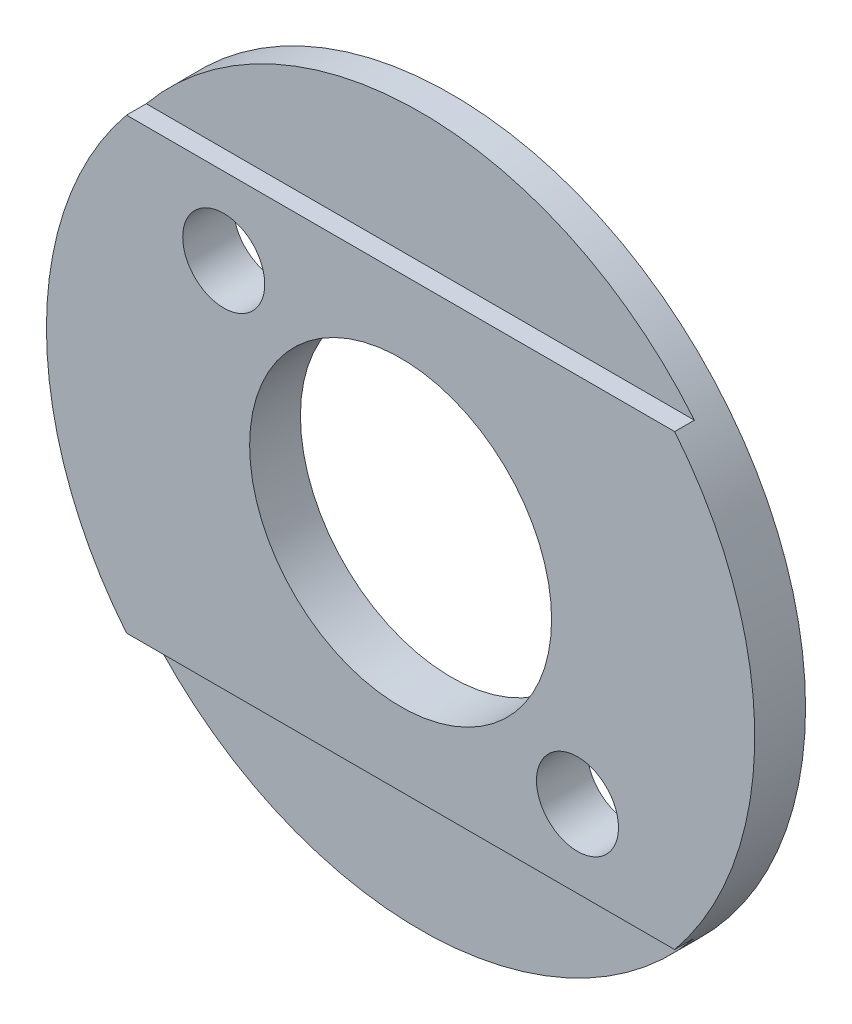
ISO-10303-21;
HEADER;
FILE_DESCRIPTION(('STEP AP214'),'2;1');
FILE_NAME('part.step','',(''),(''),'','','');
FILE_SCHEMA(('AUTOMOTIVE_DESIGN { 1 0 10303 214 1 1 1 1 }'));
ENDSEC;
DATA;
#1=APPLICATION_CONTEXT('core data for automotive mechanical design processes');
#2=APPLICATION_PROTOCOL_DEFINITION('international standard','automotive_design',2000,#1);
#3=PRODUCT_CONTEXT('',#1,'mechanical');
#4=PRODUCT('Part','Part','',(#3));
#5=PRODUCT_RELATED_PRODUCT_CATEGORY('part','',(#4));
#6=PRODUCT_DEFINITION_FORMATION('','',#4);
#7=PRODUCT_DEFINITION_CONTEXT('part definition',#1,'design');
#8=PRODUCT_DEFINITION('design','',#6,#7);
#9=PRODUCT_DEFINITION_SHAPE('','',#8);
#10=(LENGTH_UNIT() NAMED_UNIT(*) SI_UNIT(.MILLI.,.METRE.));
#11=(NAMED_UNIT(*) PLANE_ANGLE_UNIT() SI_UNIT($,.RADIAN.));
#12=(NAMED_UNIT(*) SI_UNIT($,.STERADIAN.) SOLID_ANGLE_UNIT());
#13=UNCERTAINTY_MEASURE_WITH_UNIT(LENGTH_MEASURE(1.E-05),#10,'distance_accuracy_value','');
#14=(GEOMETRIC_REPRESENTATION_CONTEXT(3) GLOBAL_UNCERTAINTY_ASSIGNED_CONTEXT((#13)) GLOBAL_UNIT_ASSIGNED_CONTEXT((#10,
#11,#12)) REPRESENTATION_CONTEXT('',''));
#15=CARTESIAN_POINT('',(0.,0.,0.));
#16=DIRECTION('',(0.,0.,1.));
#17=DIRECTION('',(1.,0.,0.));
#18=AXIS2_PLACEMENT_3D('',#15,#16,#17);
#19=CARTESIAN_POINT('',(0.,-60.0835962088021,1.5875));
#20=DIRECTION('',(0.,1.,0.));
#21=DIRECTION('',(0.,0.,1.));
#22=AXIS2_PLACEMENT_3D('',#19,#20,#21);
#23=PLANE('',#22);
#24=DIRECTION('',(1.,0.,0.));
#25=VECTOR('',#24,1.);
#26=CARTESIAN_POINT('',(0.,-60.0835962088021,0.));
#27=LINE('',#26,#25);
#28=CARTESIAN_POINT('',(-48.7637822346546,-60.0835962088021,0.));
#29=VERTEX_POINT('',#28);
#30=CARTESIAN_POINT('',(-4.65267252292782,-60.0835962088021,0.));
#31=VERTEX_POINT('',#30);
#32=EDGE_CURVE('E74',#29,#31,#27,.T.);
#33=ORIENTED_EDGE('',*,*,#32,.F.);
#34=DIRECTION('',(0.,0.,-1.));
#35=VECTOR('',#34,1.);
#36=CARTESIAN_POINT('',(-48.7637822346546,-60.0835962088021,1.5875));
#37=LINE('',#36,#35);
#38=CARTESIAN_POINT('',(-48.7637822346546,-60.0835962088021,1.5875));
#39=VERTEX_POINT('',#38);
#40=EDGE_CURVE('E11',#39,#29,#37,.T.);
#41=ORIENTED_EDGE('',*,*,#40,.F.);
#42=DIRECTION('',(1.,0.,0.));
#43=VECTOR('',#42,1.);
#44=CARTESIAN_POINT('',(0.,-60.0835962088021,1.5875));
#45=LINE('',#44,#43);
#46=CARTESIAN_POINT('',(-4.65267252292782,-60.0835962088021,1.5875));
#47=VERTEX_POINT('',#46);
#48=EDGE_CURVE('E122',#39,#47,#45,.T.);
#49=ORIENTED_EDGE('',*,*,#48,.T.);
#50=DIRECTION('',(0.,0.,-1.));
#51=VECTOR('',#50,1.);
#52=CARTESIAN_POINT('',(-4.65267252292782,-60.0835962088021,1.5875));
#53=LINE('',#52,#51);
#54=EDGE_CURVE('E89',#47,#31,#53,.T.);
#55=ORIENTED_EDGE('',*,*,#54,.T.);
#56=EDGE_LOOP('',(#33,#41,#49,#55));
#57=FACE_BOUND('',#56,.T.);
#58=ADVANCED_FACE('F35',(#57),#23,.T.);
#59=CARTESIAN_POINT('',(0.,-96.1835962088021,1.5875));
#60=DIRECTION('',(0.,1.,0.));
#61=DIRECTION('',(0.,0.,1.));
#62=AXIS2_PLACEMENT_3D('',#59,#60,#61);
#63=PLANE('',#62);
#64=DIRECTION('',(1.,0.,0.));
#65=VECTOR('',#64,1.);
#66=CARTESIAN_POINT('',(0.,-96.1835962088021,0.));
#67=LINE('',#66,#65);
#68=CARTESIAN_POINT('',(-48.7637822346546,-96.1835962088021,0.));
#69=VERTEX_POINT('',#68);
#70=CARTESIAN_POINT('',(-4.65267252292777,-96.1835962088021,0.));
#71=VERTEX_POINT('',#70);
#72=EDGE_CURVE('E90',#69,#71,#67,.T.);
#73=ORIENTED_EDGE('',*,*,#72,.T.);
#74=DIRECTION('',(0.,0.,-1.));
#75=VECTOR('',#74,1.);
#76=CARTESIAN_POINT('',(-4.65267252292777,-96.1835962088021,1.5875));
#77=LINE('',#76,#75);
#78=CARTESIAN_POINT('',(-4.65267252292777,-96.1835962088021,1.5875));
#79=VERTEX_POINT('',#78);
#80=EDGE_CURVE('E104',#79,#71,#77,.T.);
#81=ORIENTED_EDGE('',*,*,#80,.F.);
#82=DIRECTION('',(1.,0.,0.));
#83=VECTOR('',#82,1.);
#84=CARTESIAN_POINT('',(0.,-96.1835962088021,1.5875));
#85=LINE('',#84,#83);
#86=CARTESIAN_POINT('',(-48.7637822346546,-96.1835962088021,1.5875));
#87=VERTEX_POINT('',#86);
#88=EDGE_CURVE('E100',#87,#79,#85,.T.);
#89=ORIENTED_EDGE('',*,*,#88,.F.);
#90=DIRECTION('',(0.,0.,-1.));
#91=VECTOR('',#90,1.);
#92=CARTESIAN_POINT('',(-48.7637822346546,-96.1835962088021,1.5875));
#93=LINE('',#92,#91);
#94=EDGE_CURVE('E44',#87,#69,#93,.T.);
#95=ORIENTED_EDGE('',*,*,#94,.T.);
#96=EDGE_LOOP('',(#73,#81,#89,#95));
#97=FACE_BOUND('',#96,.T.);
#98=ADVANCED_FACE('F107',(#97),#63,.F.);
#99=CARTESIAN_POINT('',(-12.4743356104237,-89.9508008328408,1.5875));
#100=DIRECTION('',(0.,0.,-1.));
#101=DIRECTION('',(-1.,0.,0.));
#102=AXIS2_PLACEMENT_3D('',#99,#100,#101);
#103=CYLINDRICAL_SURFACE('',#102,3.3);
#104=CARTESIAN_POINT('',(-12.4743356104237,-89.9508008328408,1.5875));
#105=DIRECTION('',(0.,0.,1.));
#106=DIRECTION('',(1.,0.,0.));
#107=AXIS2_PLACEMENT_3D('',#104,#105,#106);
#108=CIRCLE('',#107,3.3);
#109=CARTESIAN_POINT('',(-9.1743356104237,-89.9508008328408,1.5875));
#110=VERTEX_POINT('',#109);
#111=EDGE_CURVE('E119',#110,#110,#108,.T.);
#112=ORIENTED_EDGE('',*,*,#111,.T.);
#113=EDGE_LOOP('',(#112));
#114=FACE_BOUND('',#113,.T.);
#115=CARTESIAN_POINT('',(-12.4743356104237,-89.9508008328408,-2.5));
#116=DIRECTION('',(0.,0.,-1.));
#117=DIRECTION('',(-1.,0.,0.));
#118=AXIS2_PLACEMENT_3D('',#115,#116,#117);
#119=CIRCLE('',#118,3.3);
#120=CARTESIAN_POINT('',(-15.7743356104237,-89.9508008328408,-2.5));
#121=VERTEX_POINT('',#120);
#122=EDGE_CURVE('E97',#121,#121,#119,.F.);
#123=ORIENTED_EDGE('',*,*,#122,.F.);
#124=EDGE_LOOP('',(#123));
#125=FACE_BOUND('',#124,.T.);
#126=ADVANCED_FACE('F142',(#114,#125),#103,.F.);
#127=CARTESIAN_POINT('',(-40.9421191471587,-66.3163915847635,1.5875));
#128=DIRECTION('',(0.,0.,-1.));
#129=DIRECTION('',(-1.,0.,0.));
#130=AXIS2_PLACEMENT_3D('',#127,#128,#129);
#131=CYLINDRICAL_SURFACE('',#130,3.3);
#132=CARTESIAN_POINT('',(-40.9421191471587,-66.3163915847635,1.5875));
#133=DIRECTION('',(0.,0.,1.));
#134=DIRECTION('',(1.,0.,0.));
#135=AXIS2_PLACEMENT_3D('',#132,#133,#134);
#136=CIRCLE('',#135,3.3);
#137=CARTESIAN_POINT('',(-37.6421191471587,-66.3163915847635,1.5875));
#138=VERTEX_POINT('',#137);
#139=EDGE_CURVE('E116',#138,#138,#136,.T.);
#140=ORIENTED_EDGE('',*,*,#139,.T.);
#141=EDGE_LOOP('',(#140));
#142=FACE_BOUND('',#141,.T.);
#143=CARTESIAN_POINT('',(-40.9421191471587,-66.3163915847635,-2.5));
#144=DIRECTION('',(0.,0.,-1.));
#145=DIRECTION('',(-1.,0.,0.));
#146=AXIS2_PLACEMENT_3D('',#143,#144,#145);
#147=CIRCLE('',#146,3.3);
#148=CARTESIAN_POINT('',(-44.2421191471587,-66.3163915847635,-2.5));
#149=VERTEX_POINT('',#148);
#150=EDGE_CURVE('E77',#149,#149,#147,.F.);
#151=ORIENTED_EDGE('',*,*,#150,.F.);
#152=EDGE_LOOP('',(#151));
#153=FACE_BOUND('',#152,.T.);
#154=ADVANCED_FACE('F146',(#142,#153),#131,.F.);
#155=CARTESIAN_POINT('',(-26.7082273787912,-78.1335962088021,1.5875));
#156=DIRECTION('',(0.,0.,-1.));
#157=DIRECTION('',(-1.,0.,0.));
#158=AXIS2_PLACEMENT_3D('',#155,#156,#157);
#159=CYLINDRICAL_SURFACE('',#158,12.15);
#160=CARTESIAN_POINT('',(-26.7082273787912,-78.1335962088021,1.5875));
#161=DIRECTION('',(0.,0.,1.));
#162=DIRECTION('',(1.,0.,0.));
#163=AXIS2_PLACEMENT_3D('',#160,#161,#162);
#164=CIRCLE('',#163,12.15);
#165=CARTESIAN_POINT('',(-14.5582273787912,-78.1335962088021,1.5875));
#166=VERTEX_POINT('',#165);
#167=EDGE_CURVE('E94',#166,#166,#164,.T.);
#168=ORIENTED_EDGE('',*,*,#167,.T.);
#169=EDGE_LOOP('',(#168));
#170=FACE_BOUND('',#169,.T.);
#171=CARTESIAN_POINT('',(-26.7082273787912,-78.1335962088021,-2.5));
#172=DIRECTION('',(0.,0.,-1.));
#173=DIRECTION('',(-1.,0.,0.));
#174=AXIS2_PLACEMENT_3D('',#171,#172,#173);
#175=CIRCLE('',#174,12.15);
#176=CARTESIAN_POINT('',(-38.8582273787912,-78.1335962088021,-2.5));
#177=VERTEX_POINT('',#176);
#178=EDGE_CURVE('E91',#177,#177,#175,.F.);
#179=ORIENTED_EDGE('',*,*,#178,.F.);
#180=EDGE_LOOP('',(#179));
#181=FACE_BOUND('',#180,.T.);
#182=ADVANCED_FACE('F37',(#170,#181),#159,.F.);
#183=CARTESIAN_POINT('',(-26.7082273787912,-78.1335962088021,1.5875));
#184=DIRECTION('',(0.,0.,-1.));
#185=DIRECTION('',(-1.,0.,0.));
#186=AXIS2_PLACEMENT_3D('',#183,#184,#185);
#187=CYLINDRICAL_SURFACE('',#186,28.5);
#188=ORIENTED_EDGE('',*,*,#80,.T.);
#189=CARTESIAN_POINT('',(-26.7082273787912,-78.1335962088021,0.));
#190=DIRECTION('',(0.,0.,-1.));
#191=DIRECTION('',(-1.,0.,0.));
#192=AXIS2_PLACEMENT_3D('',#189,#190,#191);
#193=CIRCLE('',#192,28.5);
#194=EDGE_CURVE('E78',#71,#69,#193,.T.);
#195=ORIENTED_EDGE('',*,*,#194,.T.);
#196=ORIENTED_EDGE('',*,*,#94,.F.);
#197=CARTESIAN_POINT('',(-26.7082273787912,-78.1335962088021,1.5875));
#198=DIRECTION('',(0.,0.,1.));
#199=DIRECTION('',(1.,0.,0.));
#200=AXIS2_PLACEMENT_3D('',#197,#198,#199);
#201=CIRCLE('',#200,28.5);
#202=EDGE_CURVE('E86',#39,#87,#201,.T.);
#203=ORIENTED_EDGE('',*,*,#202,.F.);
#204=ORIENTED_EDGE('',*,*,#40,.T.);
#205=EDGE_CURVE('E71',#29,#31,#193,.T.);
#206=ORIENTED_EDGE('',*,*,#205,.T.);
#207=ORIENTED_EDGE('',*,*,#54,.F.);
#208=EDGE_CURVE('E51',#79,#47,#201,.T.);
#209=ORIENTED_EDGE('',*,*,#208,.F.);
#210=EDGE_LOOP('',(#188,#195,#196,#203,#204,#206,#207,#209));
#211=FACE_BOUND('',#210,.T.);
#212=CARTESIAN_POINT('',(-26.7082273787912,-78.1335962088021,-2.5));
#213=DIRECTION('',(0.,0.,-1.));
#214=DIRECTION('',(-1.,0.,0.));
#215=AXIS2_PLACEMENT_3D('',#212,#213,#214);
#216=CIRCLE('',#215,28.5);
#217=CARTESIAN_POINT('',(-55.2082273787912,-78.1335962088021,-2.5));
#218=VERTEX_POINT('',#217);
#219=EDGE_CURVE('E159',#218,#218,#216,.T.);
#220=ORIENTED_EDGE('',*,*,#219,.F.);
#221=EDGE_LOOP('',(#220));
#222=FACE_BOUND('',#221,.T.);
#223=ADVANCED_FACE('F82',(#211,#222),#187,.T.);
#224=CARTESIAN_POINT('',(0.,0.,1.5875));
#225=DIRECTION('',(0.,0.,1.));
#226=DIRECTION('',(1.,0.,0.));
#227=AXIS2_PLACEMENT_3D('',#224,#225,#226);
#228=PLANE('',#227);
#229=ORIENTED_EDGE('',*,*,#167,.F.);
#230=EDGE_LOOP('',(#229));
#231=FACE_BOUND('',#230,.T.);
#232=ORIENTED_EDGE('',*,*,#139,.F.);
#233=EDGE_LOOP('',(#232));
#234=FACE_BOUND('',#233,.T.);
#235=ORIENTED_EDGE('',*,*,#111,.F.);
#236=EDGE_LOOP('',(#235));
#237=FACE_BOUND('',#236,.T.);
#238=ORIENTED_EDGE('',*,*,#48,.F.);
#239=ORIENTED_EDGE('',*,*,#202,.T.);
#240=ORIENTED_EDGE('',*,*,#88,.T.);
#241=ORIENTED_EDGE('',*,*,#208,.T.);
#242=EDGE_LOOP('',(#238,#239,#240,#241));
#243=FACE_BOUND('',#242,.T.);
#244=ADVANCED_FACE('F123',(#231,#234,#237,#243),#228,.T.);
#245=CARTESIAN_POINT('',(0.,0.,0.));
#246=DIRECTION('',(0.,0.,-1.));
#247=DIRECTION('',(-1.,0.,0.));
#248=AXIS2_PLACEMENT_3D('',#245,#246,#247);
#249=PLANE('',#248);
#250=ORIENTED_EDGE('',*,*,#205,.F.);
#251=ORIENTED_EDGE('',*,*,#32,.T.);
#252=EDGE_LOOP('',(#250,#251));
#253=FACE_BOUND('',#252,.T.);
#254=ADVANCED_FACE('F72',(#253),#249,.F.);
#255=CARTESIAN_POINT('',(0.,0.,-2.5));
#256=DIRECTION('',(0.,0.,-1.));
#257=DIRECTION('',(-1.,0.,0.));
#258=AXIS2_PLACEMENT_3D('',#255,#256,#257);
#259=PLANE('',#258);
#260=ORIENTED_EDGE('',*,*,#150,.T.);
#261=EDGE_LOOP('',(#260));
#262=FACE_BOUND('',#261,.T.);
#263=ORIENTED_EDGE('',*,*,#219,.T.);
#264=EDGE_LOOP('',(#263));
#265=FACE_BOUND('',#264,.T.);
#266=ORIENTED_EDGE('',*,*,#122,.T.);
#267=EDGE_LOOP('',(#266));
#268=FACE_BOUND('',#267,.T.);
#269=ORIENTED_EDGE('',*,*,#178,.T.);
#270=EDGE_LOOP('',(#269));
#271=FACE_BOUND('',#270,.T.);
#272=ADVANCED_FACE('F131',(#262,#265,#268,#271),#259,.T.);
#273=ORIENTED_EDGE('',*,*,#72,.F.);
#274=ORIENTED_EDGE('',*,*,#194,.F.);
#275=EDGE_LOOP('',(#273,#274));
#276=FACE_BOUND('',#275,.T.);
#277=ADVANCED_FACE('F133',(#276),#249,.F.);
#278=CLOSED_SHELL('',(#58,#98,#126,#154,#182,#223,#244,#254,#272,#277));
#279=MANIFOLD_SOLID_BREP('B2',#278);
#280=ADVANCED_BREP_SHAPE_REPRESENTATION('',(#18,#279),#14);
#281=SHAPE_DEFINITION_REPRESENTATION(#9,#280);
ENDSEC;
END-ISO-10303-21;
